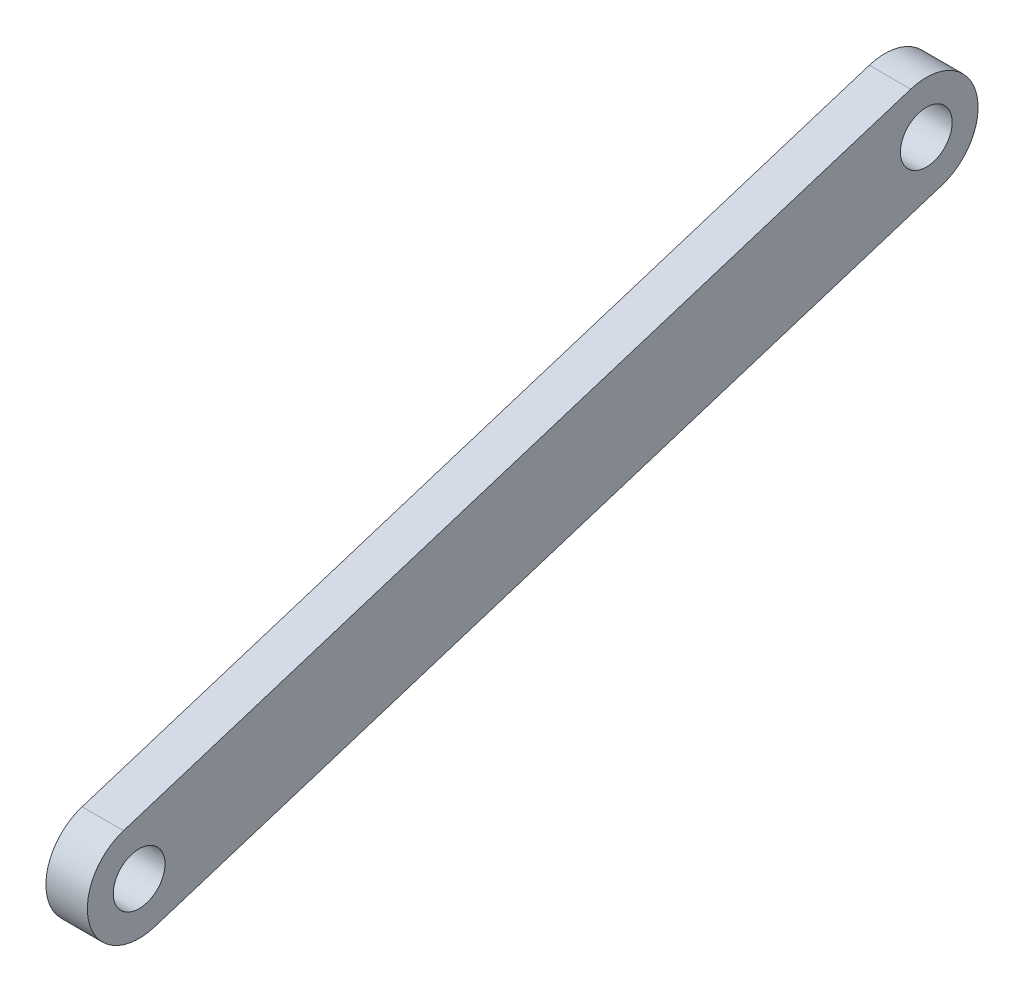
ISO-10303-21;
HEADER;
FILE_DESCRIPTION(('STEP AP214'),'2;1');
FILE_NAME('part.step','',(''),(''),'','','');
FILE_SCHEMA(('AUTOMOTIVE_DESIGN { 1 0 10303 214 1 1 1 1 }'));
ENDSEC;
DATA;
#1=APPLICATION_CONTEXT('core data for automotive mechanical design processes');
#2=APPLICATION_PROTOCOL_DEFINITION('international standard','automotive_design',2000,#1);
#3=PRODUCT_CONTEXT('',#1,'mechanical');
#4=PRODUCT('Part','Part','',(#3));
#5=PRODUCT_RELATED_PRODUCT_CATEGORY('part','',(#4));
#6=PRODUCT_DEFINITION_FORMATION('','',#4);
#7=PRODUCT_DEFINITION_CONTEXT('part definition',#1,'design');
#8=PRODUCT_DEFINITION('design','',#6,#7);
#9=PRODUCT_DEFINITION_SHAPE('','',#8);
#10=(LENGTH_UNIT() NAMED_UNIT(*) SI_UNIT(.MILLI.,.METRE.));
#11=(NAMED_UNIT(*) PLANE_ANGLE_UNIT() SI_UNIT($,.RADIAN.));
#12=(NAMED_UNIT(*) SI_UNIT($,.STERADIAN.) SOLID_ANGLE_UNIT());
#13=UNCERTAINTY_MEASURE_WITH_UNIT(LENGTH_MEASURE(1.E-05),#10,'distance_accuracy_value','');
#14=(GEOMETRIC_REPRESENTATION_CONTEXT(3) GLOBAL_UNCERTAINTY_ASSIGNED_CONTEXT((#13)) GLOBAL_UNIT_ASSIGNED_CONTEXT((#10,
#11,#12)) REPRESENTATION_CONTEXT('',''));
#15=CARTESIAN_POINT('',(0.,0.,0.));
#16=DIRECTION('',(0.,0.,1.));
#17=DIRECTION('',(1.,0.,0.));
#18=AXIS2_PLACEMENT_3D('',#15,#16,#17);
#19=CARTESIAN_POINT('',(50.,0.,0.));
#20=DIRECTION('',(1.,0.,0.));
#21=DIRECTION('',(0.,0.,-1.));
#22=AXIS2_PLACEMENT_3D('',#19,#20,#21);
#23=PLANE('',#22);
#24=CARTESIAN_POINT('',(50.,0.,0.));
#25=DIRECTION('',(1.,0.,0.));
#26=DIRECTION('',(0.,0.,-1.));
#27=AXIS2_PLACEMENT_3D('',#24,#25,#26);
#28=CIRCLE('',#27,31.25);
#29=CARTESIAN_POINT('',(50.,0.,-31.25));
#30=VERTEX_POINT('',#29);
#31=EDGE_CURVE('E102',#30,#30,#28,.T.);
#32=ORIENTED_EDGE('',*,*,#31,.F.);
#33=EDGE_LOOP('',(#32));
#34=FACE_BOUND('',#33,.T.);
#35=CARTESIAN_POINT('',(50.,0.,0.));
#36=DIRECTION('',(1.,0.,0.));
#37=DIRECTION('',(0.,0.,-1.));
#38=AXIS2_PLACEMENT_3D('',#35,#36,#37);
#39=CIRCLE('',#38,62.5);
#40=CARTESIAN_POINT('',(50.,59.5989165708839,18.8207104960686));
#41=VERTEX_POINT('',#40);
#42=CARTESIAN_POINT('',(50.,-59.5989165708838,-18.8207104960686));
#43=VERTEX_POINT('',#42);
#44=EDGE_CURVE('E87',#41,#43,#39,.T.);
#45=ORIENTED_EDGE('',*,*,#44,.T.);
#46=DIRECTION('',(0.,0.301131367937097,-0.953582665134142));
#47=VECTOR('',#46,1.);
#48=CARTESIAN_POINT('',(50.,-59.5989165708838,-18.8207104960686));
#49=LINE('',#48,#47);
#50=CARTESIAN_POINT('',(50.,240.401083429116,-968.820710496068));
#51=VERTEX_POINT('',#50);
#52=EDGE_CURVE('E82',#43,#51,#49,.T.);
#53=ORIENTED_EDGE('',*,*,#52,.T.);
#54=CARTESIAN_POINT('',(50.,300.,-950.));
#55=DIRECTION('',(1.,0.,0.));
#56=DIRECTION('',(0.,0.,-1.));
#57=AXIS2_PLACEMENT_3D('',#54,#55,#56);
#58=CIRCLE('',#57,62.5000000000001);
#59=CARTESIAN_POINT('',(50.,359.598916570884,-931.179289503931));
#60=VERTEX_POINT('',#59);
#61=EDGE_CURVE('E85',#51,#60,#58,.T.);
#62=ORIENTED_EDGE('',*,*,#61,.T.);
#63=DIRECTION('',(0.,-0.301131367937097,0.953582665134142));
#64=VECTOR('',#63,1.);
#65=CARTESIAN_POINT('',(50.,59.5989165708839,18.8207104960686));
#66=LINE('',#65,#64);
#67=EDGE_CURVE('E52',#60,#41,#66,.T.);
#68=ORIENTED_EDGE('',*,*,#67,.T.);
#69=EDGE_LOOP('',(#45,#53,#62,#68));
#70=FACE_BOUND('',#69,.T.);
#71=CARTESIAN_POINT('',(50.,300.,-950.));
#72=DIRECTION('',(1.,0.,0.));
#73=DIRECTION('',(0.,0.,-1.));
#74=AXIS2_PLACEMENT_3D('',#71,#72,#73);
#75=CIRCLE('',#74,31.2499999999998);
#76=CARTESIAN_POINT('',(50.,300.,-981.25));
#77=VERTEX_POINT('',#76);
#78=EDGE_CURVE('E117',#77,#77,#75,.T.);
#79=ORIENTED_EDGE('',*,*,#78,.F.);
#80=EDGE_LOOP('',(#79));
#81=FACE_BOUND('',#80,.T.);
#82=ADVANCED_FACE('F35',(#34,#70,#81),#23,.T.);
#83=CARTESIAN_POINT('',(0.,0.,0.));
#84=DIRECTION('',(1.,0.,0.));
#85=DIRECTION('',(0.,0.,-1.));
#86=AXIS2_PLACEMENT_3D('',#83,#84,#85);
#87=PLANE('',#86);
#88=CARTESIAN_POINT('',(0.,0.,0.));
#89=DIRECTION('',(1.,0.,0.));
#90=DIRECTION('',(0.,0.,-1.));
#91=AXIS2_PLACEMENT_3D('',#88,#89,#90);
#92=CIRCLE('',#91,31.25);
#93=CARTESIAN_POINT('',(0.,0.,-31.25));
#94=VERTEX_POINT('',#93);
#95=EDGE_CURVE('E114',#94,#94,#92,.T.);
#96=ORIENTED_EDGE('',*,*,#95,.T.);
#97=EDGE_LOOP('',(#96));
#98=FACE_BOUND('',#97,.T.);
#99=CARTESIAN_POINT('',(0.,0.,0.));
#100=DIRECTION('',(1.,0.,0.));
#101=DIRECTION('',(0.,0.,-1.));
#102=AXIS2_PLACEMENT_3D('',#99,#100,#101);
#103=CIRCLE('',#102,62.5);
#104=CARTESIAN_POINT('',(0.,59.5989165708839,18.8207104960686));
#105=VERTEX_POINT('',#104);
#106=CARTESIAN_POINT('',(0.,-59.5989165708838,-18.8207104960686));
#107=VERTEX_POINT('',#106);
#108=EDGE_CURVE('E99',#105,#107,#103,.T.);
#109=ORIENTED_EDGE('',*,*,#108,.F.);
#110=DIRECTION('',(0.,-0.301131367937097,0.953582665134142));
#111=VECTOR('',#110,1.);
#112=CARTESIAN_POINT('',(0.,59.5989165708839,18.8207104960686));
#113=LINE('',#112,#111);
#114=CARTESIAN_POINT('',(0.,359.598916570884,-931.179289503931));
#115=VERTEX_POINT('',#114);
#116=EDGE_CURVE('E75',#115,#105,#113,.T.);
#117=ORIENTED_EDGE('',*,*,#116,.F.);
#118=CARTESIAN_POINT('',(0.,300.,-950.));
#119=DIRECTION('',(1.,0.,0.));
#120=DIRECTION('',(0.,0.,-1.));
#121=AXIS2_PLACEMENT_3D('',#118,#119,#120);
#122=CIRCLE('',#121,62.5000000000001);
#123=CARTESIAN_POINT('',(0.,240.401083429116,-968.820710496068));
#124=VERTEX_POINT('',#123);
#125=EDGE_CURVE('E69',#124,#115,#122,.T.);
#126=ORIENTED_EDGE('',*,*,#125,.F.);
#127=DIRECTION('',(0.,0.301131367937097,-0.953582665134142));
#128=VECTOR('',#127,1.);
#129=CARTESIAN_POINT('',(0.,-59.5989165708838,-18.8207104960686));
#130=LINE('',#129,#128);
#131=EDGE_CURVE('E91',#107,#124,#130,.T.);
#132=ORIENTED_EDGE('',*,*,#131,.F.);
#133=EDGE_LOOP('',(#109,#117,#126,#132));
#134=FACE_BOUND('',#133,.T.);
#135=CARTESIAN_POINT('',(0.,300.,-950.));
#136=DIRECTION('',(1.,0.,0.));
#137=DIRECTION('',(0.,0.,-1.));
#138=AXIS2_PLACEMENT_3D('',#135,#136,#137);
#139=CIRCLE('',#138,31.2499999999998);
#140=CARTESIAN_POINT('',(0.,300.,-981.25));
#141=VERTEX_POINT('',#140);
#142=EDGE_CURVE('E120',#141,#141,#139,.T.);
#143=ORIENTED_EDGE('',*,*,#142,.T.);
#144=EDGE_LOOP('',(#143));
#145=FACE_BOUND('',#144,.T.);
#146=ADVANCED_FACE('F110',(#98,#134,#145),#87,.F.);
#147=CARTESIAN_POINT('',(50.,0.,0.));
#148=DIRECTION('',(-1.,0.,0.));
#149=DIRECTION('',(0.,0.,1.));
#150=AXIS2_PLACEMENT_3D('',#147,#148,#149);
#151=CYLINDRICAL_SURFACE('',#150,62.5);
#152=ORIENTED_EDGE('',*,*,#108,.T.);
#153=DIRECTION('',(-1.,0.,0.));
#154=VECTOR('',#153,1.);
#155=CARTESIAN_POINT('',(50.,-59.5989165708838,-18.8207104960686));
#156=LINE('',#155,#154);
#157=EDGE_CURVE('E11',#43,#107,#156,.T.);
#158=ORIENTED_EDGE('',*,*,#157,.F.);
#159=ORIENTED_EDGE('',*,*,#44,.F.);
#160=DIRECTION('',(-1.,0.,0.));
#161=VECTOR('',#160,1.);
#162=CARTESIAN_POINT('',(50.,59.5989165708839,18.8207104960686));
#163=LINE('',#162,#161);
#164=EDGE_CURVE('E95',#41,#105,#163,.T.);
#165=ORIENTED_EDGE('',*,*,#164,.T.);
#166=EDGE_LOOP('',(#152,#158,#159,#165));
#167=FACE_BOUND('',#166,.T.);
#168=ADVANCED_FACE('F37',(#167),#151,.T.);
#169=CARTESIAN_POINT('',(50.,-59.5989165708838,-18.8207104960686));
#170=DIRECTION('',(0.,0.953582665134142,0.301131367937097));
#171=DIRECTION('',(0.,-0.301131367937097,0.953582665134142));
#172=AXIS2_PLACEMENT_3D('',#169,#170,#171);
#173=PLANE('',#172);
#174=ORIENTED_EDGE('',*,*,#131,.T.);
#175=DIRECTION('',(-1.,0.,0.));
#176=VECTOR('',#175,1.);
#177=CARTESIAN_POINT('',(50.,240.401083429116,-968.820710496068));
#178=LINE('',#177,#176);
#179=EDGE_CURVE('E44',#51,#124,#178,.T.);
#180=ORIENTED_EDGE('',*,*,#179,.F.);
#181=ORIENTED_EDGE('',*,*,#52,.F.);
#182=ORIENTED_EDGE('',*,*,#157,.T.);
#183=EDGE_LOOP('',(#174,#180,#181,#182));
#184=FACE_BOUND('',#183,.T.);
#185=ADVANCED_FACE('F90',(#184),#173,.F.);
#186=CARTESIAN_POINT('',(50.,300.,-950.));
#187=DIRECTION('',(-1.,0.,0.));
#188=DIRECTION('',(0.,0.,1.));
#189=AXIS2_PLACEMENT_3D('',#186,#187,#188);
#190=CYLINDRICAL_SURFACE('',#189,62.5000000000001);
#191=ORIENTED_EDGE('',*,*,#125,.T.);
#192=DIRECTION('',(-1.,0.,0.));
#193=VECTOR('',#192,1.);
#194=CARTESIAN_POINT('',(50.,359.598916570884,-931.179289503931));
#195=LINE('',#194,#193);
#196=EDGE_CURVE('E92',#60,#115,#195,.T.);
#197=ORIENTED_EDGE('',*,*,#196,.F.);
#198=ORIENTED_EDGE('',*,*,#61,.F.);
#199=ORIENTED_EDGE('',*,*,#179,.T.);
#200=EDGE_LOOP('',(#191,#197,#198,#199));
#201=FACE_BOUND('',#200,.T.);
#202=ADVANCED_FACE('F93',(#201),#190,.T.);
#203=CARTESIAN_POINT('',(50.,59.5989165708839,18.8207104960686));
#204=DIRECTION('',(0.,-0.953582665134142,-0.301131367937097));
#205=DIRECTION('',(0.,0.301131367937097,-0.953582665134142));
#206=AXIS2_PLACEMENT_3D('',#203,#204,#205);
#207=PLANE('',#206);
#208=ORIENTED_EDGE('',*,*,#116,.T.);
#209=ORIENTED_EDGE('',*,*,#164,.F.);
#210=ORIENTED_EDGE('',*,*,#67,.F.);
#211=ORIENTED_EDGE('',*,*,#196,.T.);
#212=EDGE_LOOP('',(#208,#209,#210,#211));
#213=FACE_BOUND('',#212,.T.);
#214=ADVANCED_FACE('F107',(#213),#207,.F.);
#215=CARTESIAN_POINT('',(50.,0.,0.));
#216=DIRECTION('',(-1.,0.,0.));
#217=DIRECTION('',(0.,0.,1.));
#218=AXIS2_PLACEMENT_3D('',#215,#216,#217);
#219=CYLINDRICAL_SURFACE('',#218,31.25);
#220=ORIENTED_EDGE('',*,*,#31,.T.);
#221=EDGE_LOOP('',(#220));
#222=FACE_BOUND('',#221,.T.);
#223=ORIENTED_EDGE('',*,*,#95,.F.);
#224=EDGE_LOOP('',(#223));
#225=FACE_BOUND('',#224,.T.);
#226=ADVANCED_FACE('F138',(#222,#225),#219,.F.);
#227=CARTESIAN_POINT('',(50.,300.,-950.));
#228=DIRECTION('',(-1.,0.,0.));
#229=DIRECTION('',(0.,0.,1.));
#230=AXIS2_PLACEMENT_3D('',#227,#228,#229);
#231=CYLINDRICAL_SURFACE('',#230,31.2499999999998);
#232=ORIENTED_EDGE('',*,*,#78,.T.);
#233=EDGE_LOOP('',(#232));
#234=FACE_BOUND('',#233,.T.);
#235=ORIENTED_EDGE('',*,*,#142,.F.);
#236=EDGE_LOOP('',(#235));
#237=FACE_BOUND('',#236,.T.);
#238=ADVANCED_FACE('F126',(#234,#237),#231,.F.);
#239=CLOSED_SHELL('',(#82,#146,#168,#185,#202,#214,#226,#238));
#240=MANIFOLD_SOLID_BREP('B2',#239);
#241=ADVANCED_BREP_SHAPE_REPRESENTATION('',(#18,#240),#14);
#242=SHAPE_DEFINITION_REPRESENTATION(#9,#241);
ENDSEC;
END-ISO-10303-21;
